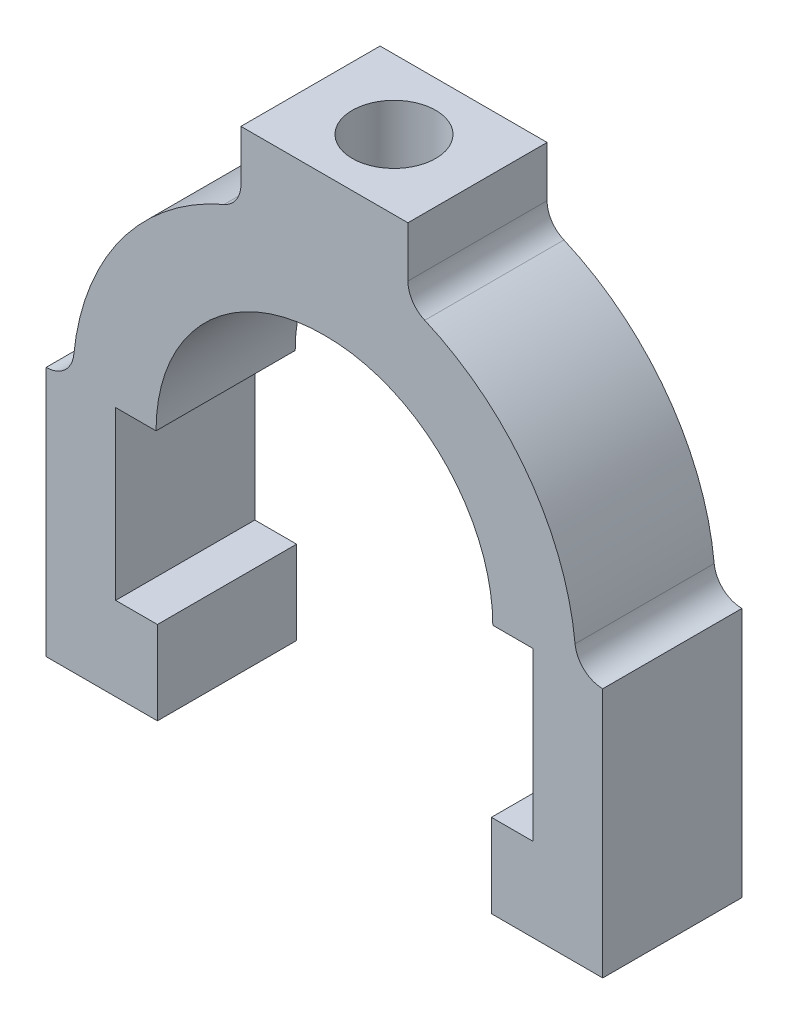
ISO-10303-21;
HEADER;
FILE_DESCRIPTION(('STEP AP214'),'2;1');
FILE_NAME('part.step','',(''),(''),'','','');
FILE_SCHEMA(('AUTOMOTIVE_DESIGN { 1 0 10303 214 1 1 1 1 }'));
ENDSEC;
DATA;
#1=APPLICATION_CONTEXT('core data for automotive mechanical design processes');
#2=APPLICATION_PROTOCOL_DEFINITION('international standard','automotive_design',2000,#1);
#3=PRODUCT_CONTEXT('',#1,'mechanical');
#4=PRODUCT('Part','Part','',(#3));
#5=PRODUCT_RELATED_PRODUCT_CATEGORY('part','',(#4));
#6=PRODUCT_DEFINITION_FORMATION('','',#4);
#7=PRODUCT_DEFINITION_CONTEXT('part definition',#1,'design');
#8=PRODUCT_DEFINITION('design','',#6,#7);
#9=PRODUCT_DEFINITION_SHAPE('','',#8);
#10=(LENGTH_UNIT() NAMED_UNIT(*) SI_UNIT(.MILLI.,.METRE.));
#11=(NAMED_UNIT(*) PLANE_ANGLE_UNIT() SI_UNIT($,.RADIAN.));
#12=(NAMED_UNIT(*) SI_UNIT($,.STERADIAN.) SOLID_ANGLE_UNIT());
#13=UNCERTAINTY_MEASURE_WITH_UNIT(LENGTH_MEASURE(1.E-05),#10,'distance_accuracy_value','');
#14=(GEOMETRIC_REPRESENTATION_CONTEXT(3) GLOBAL_UNCERTAINTY_ASSIGNED_CONTEXT((#13)) GLOBAL_UNIT_ASSIGNED_CONTEXT((#10,
#11,#12)) REPRESENTATION_CONTEXT('',''));
#15=CARTESIAN_POINT('',(0.,0.,0.));
#16=DIRECTION('',(0.,0.,1.));
#17=DIRECTION('',(1.,0.,0.));
#18=AXIS2_PLACEMENT_3D('',#15,#16,#17);
#19=CARTESIAN_POINT('',(39.7994974842648,36.,-20.));
#20=DIRECTION('',(0.,0.,1.));
#21=DIRECTION('',(1.,0.,0.));
#22=AXIS2_PLACEMENT_3D('',#19,#20,#21);
#23=CYLINDRICAL_SURFACE('',#22,36.);
#24=CARTESIAN_POINT('',(39.7994974842648,36.,0.));
#25=DIRECTION('',(0.,0.,1.));
#26=DIRECTION('',(-1.,0.,0.));
#27=AXIS2_PLACEMENT_3D('',#24,#25,#26);
#28=CIRCLE('',#27,36.);
#29=CARTESIAN_POINT('',(25.5799497484265,69.0727147689484,0.));
#30=VERTEX_POINT('',#29);
#31=CARTESIAN_POINT('',(3.97994974842647,39.6,0.));
#32=VERTEX_POINT('',#31);
#33=EDGE_CURVE('E240',#30,#32,#28,.T.);
#34=ORIENTED_EDGE('',*,*,#33,.F.);
#35=DIRECTION('',(0.,0.,1.));
#36=VECTOR('',#35,1.);
#37=CARTESIAN_POINT('',(25.5799497484265,69.0727147689484,-20.));
#38=LINE('',#37,#36);
#39=CARTESIAN_POINT('',(25.5799497484265,69.0727147689484,-20.));
#40=VERTEX_POINT('',#39);
#41=EDGE_CURVE('E50',#40,#30,#38,.T.);
#42=ORIENTED_EDGE('',*,*,#41,.F.);
#43=CARTESIAN_POINT('',(39.7994974842648,36.,-20.));
#44=DIRECTION('',(0.,0.,1.));
#45=DIRECTION('',(-1.,0.,0.));
#46=AXIS2_PLACEMENT_3D('',#43,#44,#45);
#47=CIRCLE('',#46,36.);
#48=CARTESIAN_POINT('',(3.97994974842647,39.6,-20.));
#49=VERTEX_POINT('',#48);
#50=EDGE_CURVE('E306',#40,#49,#47,.T.);
#51=ORIENTED_EDGE('',*,*,#50,.T.);
#52=DIRECTION('',(0.,0.,1.));
#53=VECTOR('',#52,1.);
#54=CARTESIAN_POINT('',(3.97994974842647,39.6,-20.));
#55=LINE('',#54,#53);
#56=EDGE_CURVE('E147',#49,#32,#55,.T.);
#57=ORIENTED_EDGE('',*,*,#56,.T.);
#58=EDGE_LOOP('',(#34,#42,#51,#57));
#59=FACE_BOUND('',#58,.T.);
#60=ADVANCED_FACE('F37',(#59),#23,.T.);
#61=CARTESIAN_POINT('',(24.,72.7474608543871,-20.));
#62=DIRECTION('',(0.,0.,1.));
#63=DIRECTION('',(1.,0.,0.));
#64=AXIS2_PLACEMENT_3D('',#61,#62,#63);
#65=CYLINDRICAL_SURFACE('',#64,4.);
#66=CARTESIAN_POINT('',(24.,72.7474608543871,0.));
#67=DIRECTION('',(0.,0.,-1.));
#68=DIRECTION('',(1.,0.,0.));
#69=AXIS2_PLACEMENT_3D('',#66,#67,#68);
#70=CIRCLE('',#69,4.);
#71=CARTESIAN_POINT('',(28.,72.7474608543871,0.));
#72=VERTEX_POINT('',#71);
#73=EDGE_CURVE('E303',#72,#30,#70,.T.);
#74=ORIENTED_EDGE('',*,*,#73,.F.);
#75=DIRECTION('',(0.,0.,1.));
#76=VECTOR('',#75,1.);
#77=CARTESIAN_POINT('',(28.,72.7474608543871,-20.));
#78=LINE('',#77,#76);
#79=CARTESIAN_POINT('',(28.,72.7474608543871,-20.));
#80=VERTEX_POINT('',#79);
#81=EDGE_CURVE('E221',#80,#72,#78,.T.);
#82=ORIENTED_EDGE('',*,*,#81,.F.);
#83=CARTESIAN_POINT('',(24.,72.7474608543871,-20.));
#84=DIRECTION('',(0.,0.,-1.));
#85=DIRECTION('',(1.,0.,0.));
#86=AXIS2_PLACEMENT_3D('',#83,#84,#85);
#87=CIRCLE('',#86,4.);
#88=EDGE_CURVE('E230',#80,#40,#87,.T.);
#89=ORIENTED_EDGE('',*,*,#88,.T.);
#90=ORIENTED_EDGE('',*,*,#41,.T.);
#91=EDGE_LOOP('',(#74,#82,#89,#90));
#92=FACE_BOUND('',#91,.T.);
#93=ADVANCED_FACE('F351',(#92),#65,.F.);
#94=CARTESIAN_POINT('',(28.,72.7474608543871,-20.));
#95=DIRECTION('',(-1.,0.,0.));
#96=DIRECTION('',(0.,0.,1.));
#97=AXIS2_PLACEMENT_3D('',#94,#95,#96);
#98=PLANE('',#97);
#99=DIRECTION('',(0.,-1.,0.));
#100=VECTOR('',#99,1.);
#101=CARTESIAN_POINT('',(28.,72.7474608543871,0.));
#102=LINE('',#101,#100);
#103=CARTESIAN_POINT('',(28.,80.,0.));
#104=VERTEX_POINT('',#103);
#105=EDGE_CURVE('E216',#104,#72,#102,.T.);
#106=ORIENTED_EDGE('',*,*,#105,.F.);
#107=DIRECTION('',(0.,0.,1.));
#108=VECTOR('',#107,1.);
#109=CARTESIAN_POINT('',(28.,80.,-20.));
#110=LINE('',#109,#108);
#111=CARTESIAN_POINT('',(28.,80.,-20.));
#112=VERTEX_POINT('',#111);
#113=EDGE_CURVE('E210',#112,#104,#110,.T.);
#114=ORIENTED_EDGE('',*,*,#113,.F.);
#115=DIRECTION('',(0.,-1.,0.));
#116=VECTOR('',#115,1.);
#117=CARTESIAN_POINT('',(28.,72.7474608543871,-20.));
#118=LINE('',#117,#116);
#119=EDGE_CURVE('E213',#112,#80,#118,.T.);
#120=ORIENTED_EDGE('',*,*,#119,.T.);
#121=ORIENTED_EDGE('',*,*,#81,.T.);
#122=EDGE_LOOP('',(#106,#114,#120,#121));
#123=FACE_BOUND('',#122,.T.);
#124=ADVANCED_FACE('F212',(#123),#98,.T.);
#125=CARTESIAN_POINT('',(28.,80.,-20.));
#126=DIRECTION('',(0.,1.,0.));
#127=DIRECTION('',(0.,0.,1.));
#128=AXIS2_PLACEMENT_3D('',#125,#126,#127);
#129=PLANE('',#128);
#130=CARTESIAN_POINT('',(40.,80.,-9.99999999999999));
#131=DIRECTION('',(0.,1.,0.));
#132=DIRECTION('',(0.,0.,1.));
#133=AXIS2_PLACEMENT_3D('',#130,#131,#132);
#134=CIRCLE('',#133,5.99999999999999);
#135=CARTESIAN_POINT('',(40.,80.,-4.00000000000001));
#136=VERTEX_POINT('',#135);
#137=EDGE_CURVE('E419',#136,#136,#134,.T.);
#138=ORIENTED_EDGE('',*,*,#137,.F.);
#139=EDGE_LOOP('',(#138));
#140=FACE_BOUND('',#139,.T.);
#141=DIRECTION('',(-1.,0.,0.));
#142=VECTOR('',#141,1.);
#143=CARTESIAN_POINT('',(28.,80.,0.));
#144=LINE('',#143,#142);
#145=CARTESIAN_POINT('',(52.,80.,0.));
#146=VERTEX_POINT('',#145);
#147=EDGE_CURVE('E300',#146,#104,#144,.T.);
#148=ORIENTED_EDGE('',*,*,#147,.F.);
#149=DIRECTION('',(0.,0.,1.));
#150=VECTOR('',#149,1.);
#151=CARTESIAN_POINT('',(52.,80.,-20.));
#152=LINE('',#151,#150);
#153=CARTESIAN_POINT('',(52.,80.,-20.));
#154=VERTEX_POINT('',#153);
#155=EDGE_CURVE('E222',#154,#146,#152,.T.);
#156=ORIENTED_EDGE('',*,*,#155,.F.);
#157=DIRECTION('',(-1.,0.,0.));
#158=VECTOR('',#157,1.);
#159=CARTESIAN_POINT('',(28.,80.,-20.));
#160=LINE('',#159,#158);
#161=EDGE_CURVE('E228',#154,#112,#160,.T.);
#162=ORIENTED_EDGE('',*,*,#161,.T.);
#163=ORIENTED_EDGE('',*,*,#113,.T.);
#164=EDGE_LOOP('',(#148,#156,#162,#163));
#165=FACE_BOUND('',#164,.T.);
#166=ADVANCED_FACE('F232',(#140,#165),#129,.T.);
#167=CARTESIAN_POINT('',(52.,72.7474608543871,-20.));
#168=DIRECTION('',(1.,0.,0.));
#169=DIRECTION('',(0.,0.,-1.));
#170=AXIS2_PLACEMENT_3D('',#167,#168,#169);
#171=PLANE('',#170);
#172=DIRECTION('',(0.,1.,0.));
#173=VECTOR('',#172,1.);
#174=CARTESIAN_POINT('',(52.,72.7474608543871,0.));
#175=LINE('',#174,#173);
#176=CARTESIAN_POINT('',(52.,72.7474608543871,0.));
#177=VERTEX_POINT('',#176);
#178=EDGE_CURVE('E297',#177,#146,#175,.T.);
#179=ORIENTED_EDGE('',*,*,#178,.F.);
#180=DIRECTION('',(0.,0.,1.));
#181=VECTOR('',#180,1.);
#182=CARTESIAN_POINT('',(52.,72.7474608543871,-20.));
#183=LINE('',#182,#181);
#184=CARTESIAN_POINT('',(52.,72.7474608543871,-20.));
#185=VERTEX_POINT('',#184);
#186=EDGE_CURVE('E310',#185,#177,#183,.T.);
#187=ORIENTED_EDGE('',*,*,#186,.F.);
#188=DIRECTION('',(0.,1.,0.));
#189=VECTOR('',#188,1.);
#190=CARTESIAN_POINT('',(52.,72.7474608543871,-20.));
#191=LINE('',#190,#189);
#192=EDGE_CURVE('E233',#185,#154,#191,.T.);
#193=ORIENTED_EDGE('',*,*,#192,.T.);
#194=ORIENTED_EDGE('',*,*,#155,.T.);
#195=EDGE_LOOP('',(#179,#187,#193,#194));
#196=FACE_BOUND('',#195,.T.);
#197=ADVANCED_FACE('F364',(#196),#171,.T.);
#198=CARTESIAN_POINT('',(56.,72.7474608543871,-20.));
#199=DIRECTION('',(0.,0.,1.));
#200=DIRECTION('',(1.,0.,0.));
#201=AXIS2_PLACEMENT_3D('',#198,#199,#200);
#202=CYLINDRICAL_SURFACE('',#201,3.99999999999999);
#203=CARTESIAN_POINT('',(56.,72.7474608543871,0.));
#204=DIRECTION('',(0.,0.,-1.));
#205=DIRECTION('',(-1.,0.,0.));
#206=AXIS2_PLACEMENT_3D('',#203,#204,#205);
#207=CIRCLE('',#206,3.99999999999999);
#208=CARTESIAN_POINT('',(54.4200502515735,69.0727147689484,0.));
#209=VERTEX_POINT('',#208);
#210=EDGE_CURVE('E294',#209,#177,#207,.T.);
#211=ORIENTED_EDGE('',*,*,#210,.F.);
#212=DIRECTION('',(0.,0.,1.));
#213=VECTOR('',#212,1.);
#214=CARTESIAN_POINT('',(54.4200502515735,69.0727147689484,-20.));
#215=LINE('',#214,#213);
#216=CARTESIAN_POINT('',(54.4200502515735,69.0727147689484,-20.));
#217=VERTEX_POINT('',#216);
#218=EDGE_CURVE('E312',#217,#209,#215,.T.);
#219=ORIENTED_EDGE('',*,*,#218,.F.);
#220=CARTESIAN_POINT('',(56.,72.7474608543871,-20.));
#221=DIRECTION('',(0.,0.,-1.));
#222=DIRECTION('',(-1.,0.,0.));
#223=AXIS2_PLACEMENT_3D('',#220,#221,#222);
#224=CIRCLE('',#223,3.99999999999999);
#225=EDGE_CURVE('E235',#217,#185,#224,.T.);
#226=ORIENTED_EDGE('',*,*,#225,.T.);
#227=ORIENTED_EDGE('',*,*,#186,.T.);
#228=EDGE_LOOP('',(#211,#219,#226,#227));
#229=FACE_BOUND('',#228,.T.);
#230=ADVANCED_FACE('F368',(#229),#202,.F.);
#231=CARTESIAN_POINT('',(40.2005025157352,36.,-20.));
#232=DIRECTION('',(0.,0.,1.));
#233=DIRECTION('',(1.,0.,0.));
#234=AXIS2_PLACEMENT_3D('',#231,#232,#233);
#235=CYLINDRICAL_SURFACE('',#234,36.);
#236=CARTESIAN_POINT('',(40.2005025157352,36.,0.));
#237=DIRECTION('',(0.,0.,1.));
#238=DIRECTION('',(1.,0.,0.));
#239=AXIS2_PLACEMENT_3D('',#236,#237,#238);
#240=CIRCLE('',#239,36.);
#241=CARTESIAN_POINT('',(76.0200502515735,39.6,0.));
#242=VERTEX_POINT('',#241);
#243=EDGE_CURVE('E291',#242,#209,#240,.T.);
#244=ORIENTED_EDGE('',*,*,#243,.F.);
#245=DIRECTION('',(0.,0.,1.));
#246=VECTOR('',#245,1.);
#247=CARTESIAN_POINT('',(76.0200502515735,39.6,-20.));
#248=LINE('',#247,#246);
#249=CARTESIAN_POINT('',(76.0200502515735,39.6,-20.));
#250=VERTEX_POINT('',#249);
#251=EDGE_CURVE('E314',#250,#242,#248,.T.);
#252=ORIENTED_EDGE('',*,*,#251,.F.);
#253=CARTESIAN_POINT('',(40.2005025157352,36.,-20.));
#254=DIRECTION('',(0.,0.,1.));
#255=DIRECTION('',(1.,0.,0.));
#256=AXIS2_PLACEMENT_3D('',#253,#254,#255);
#257=CIRCLE('',#256,36.);
#258=EDGE_CURVE('E505',#250,#217,#257,.T.);
#259=ORIENTED_EDGE('',*,*,#258,.T.);
#260=ORIENTED_EDGE('',*,*,#218,.T.);
#261=EDGE_LOOP('',(#244,#252,#259,#260));
#262=FACE_BOUND('',#261,.T.);
#263=ADVANCED_FACE('F372',(#262),#235,.T.);
#264=CARTESIAN_POINT('',(80.,40.,-20.));
#265=DIRECTION('',(0.,0.,1.));
#266=DIRECTION('',(1.,0.,0.));
#267=AXIS2_PLACEMENT_3D('',#264,#265,#266);
#268=CYLINDRICAL_SURFACE('',#267,4.);
#269=CARTESIAN_POINT('',(80.,40.,0.));
#270=DIRECTION('',(0.,0.,-1.));
#271=DIRECTION('',(-1.,0.,0.));
#272=AXIS2_PLACEMENT_3D('',#269,#270,#271);
#273=CIRCLE('',#272,4.);
#274=CARTESIAN_POINT('',(80.,36.,0.));
#275=VERTEX_POINT('',#274);
#276=EDGE_CURVE('E288',#275,#242,#273,.T.);
#277=ORIENTED_EDGE('',*,*,#276,.F.);
#278=DIRECTION('',(0.,0.,1.));
#279=VECTOR('',#278,1.);
#280=CARTESIAN_POINT('',(80.,36.,-20.));
#281=LINE('',#280,#279);
#282=CARTESIAN_POINT('',(80.,36.,-20.));
#283=VERTEX_POINT('',#282);
#284=EDGE_CURVE('E316',#283,#275,#281,.T.);
#285=ORIENTED_EDGE('',*,*,#284,.F.);
#286=CARTESIAN_POINT('',(80.,40.,-20.));
#287=DIRECTION('',(0.,0.,-1.));
#288=DIRECTION('',(-1.,0.,0.));
#289=AXIS2_PLACEMENT_3D('',#286,#287,#288);
#290=CIRCLE('',#289,4.);
#291=EDGE_CURVE('E502',#283,#250,#290,.T.);
#292=ORIENTED_EDGE('',*,*,#291,.T.);
#293=ORIENTED_EDGE('',*,*,#251,.T.);
#294=EDGE_LOOP('',(#277,#285,#292,#293));
#295=FACE_BOUND('',#294,.T.);
#296=ADVANCED_FACE('F376',(#295),#268,.F.);
#297=CARTESIAN_POINT('',(80.,0.,-20.));
#298=DIRECTION('',(1.,0.,0.));
#299=DIRECTION('',(0.,1.,0.));
#300=AXIS2_PLACEMENT_3D('',#297,#298,#299);
#301=PLANE('',#300);
#302=DIRECTION('',(0.,1.,0.));
#303=VECTOR('',#302,1.);
#304=CARTESIAN_POINT('',(80.,0.,0.));
#305=LINE('',#304,#303);
#306=CARTESIAN_POINT('',(80.,0.,0.));
#307=VERTEX_POINT('',#306);
#308=EDGE_CURVE('E285',#307,#275,#305,.T.);
#309=ORIENTED_EDGE('',*,*,#308,.F.);
#310=DIRECTION('',(0.,0.,1.));
#311=VECTOR('',#310,1.);
#312=CARTESIAN_POINT('',(80.,0.,-20.));
#313=LINE('',#312,#311);
#314=CARTESIAN_POINT('',(80.,0.,-20.));
#315=VERTEX_POINT('',#314);
#316=EDGE_CURVE('E318',#315,#307,#313,.T.);
#317=ORIENTED_EDGE('',*,*,#316,.F.);
#318=DIRECTION('',(0.,1.,0.));
#319=VECTOR('',#318,1.);
#320=CARTESIAN_POINT('',(80.,0.,-20.));
#321=LINE('',#320,#319);
#322=EDGE_CURVE('E499',#315,#283,#321,.T.);
#323=ORIENTED_EDGE('',*,*,#322,.T.);
#324=ORIENTED_EDGE('',*,*,#284,.T.);
#325=EDGE_LOOP('',(#309,#317,#323,#324));
#326=FACE_BOUND('',#325,.T.);
#327=ADVANCED_FACE('F380',(#326),#301,.T.);
#328=CARTESIAN_POINT('',(64.,0.,-20.));
#329=DIRECTION('',(0.,-1.,0.));
#330=DIRECTION('',(1.,0.,0.));
#331=AXIS2_PLACEMENT_3D('',#328,#329,#330);
#332=PLANE('',#331);
#333=DIRECTION('',(1.,0.,0.));
#334=VECTOR('',#333,1.);
#335=CARTESIAN_POINT('',(64.,0.,0.));
#336=LINE('',#335,#334);
#337=CARTESIAN_POINT('',(64.,0.,0.));
#338=VERTEX_POINT('',#337);
#339=EDGE_CURVE('E282',#338,#307,#336,.T.);
#340=ORIENTED_EDGE('',*,*,#339,.F.);
#341=DIRECTION('',(0.,0.,1.));
#342=VECTOR('',#341,1.);
#343=CARTESIAN_POINT('',(64.,0.,-20.));
#344=LINE('',#343,#342);
#345=CARTESIAN_POINT('',(64.,0.,-20.));
#346=VERTEX_POINT('',#345);
#347=EDGE_CURVE('E320',#346,#338,#344,.T.);
#348=ORIENTED_EDGE('',*,*,#347,.F.);
#349=DIRECTION('',(1.,0.,0.));
#350=VECTOR('',#349,1.);
#351=CARTESIAN_POINT('',(64.,0.,-20.));
#352=LINE('',#351,#350);
#353=EDGE_CURVE('E496',#346,#315,#352,.T.);
#354=ORIENTED_EDGE('',*,*,#353,.T.);
#355=ORIENTED_EDGE('',*,*,#316,.T.);
#356=EDGE_LOOP('',(#340,#348,#354,#355));
#357=FACE_BOUND('',#356,.T.);
#358=ADVANCED_FACE('F384',(#357),#332,.T.);
#359=CARTESIAN_POINT('',(64.,12.,-20.));
#360=DIRECTION('',(-1.,0.,0.));
#361=DIRECTION('',(0.,0.,1.));
#362=AXIS2_PLACEMENT_3D('',#359,#360,#361);
#363=PLANE('',#362);
#364=DIRECTION('',(0.,-1.,0.));
#365=VECTOR('',#364,1.);
#366=CARTESIAN_POINT('',(64.,12.,0.));
#367=LINE('',#366,#365);
#368=CARTESIAN_POINT('',(64.,12.,0.));
#369=VERTEX_POINT('',#368);
#370=EDGE_CURVE('E279',#369,#338,#367,.T.);
#371=ORIENTED_EDGE('',*,*,#370,.F.);
#372=DIRECTION('',(0.,0.,1.));
#373=VECTOR('',#372,1.);
#374=CARTESIAN_POINT('',(64.,12.,-20.));
#375=LINE('',#374,#373);
#376=CARTESIAN_POINT('',(64.,12.,-20.));
#377=VERTEX_POINT('',#376);
#378=EDGE_CURVE('E322',#377,#369,#375,.T.);
#379=ORIENTED_EDGE('',*,*,#378,.F.);
#380=DIRECTION('',(0.,-1.,0.));
#381=VECTOR('',#380,1.);
#382=CARTESIAN_POINT('',(64.,12.,-20.));
#383=LINE('',#382,#381);
#384=EDGE_CURVE('E493',#377,#346,#383,.T.);
#385=ORIENTED_EDGE('',*,*,#384,.T.);
#386=ORIENTED_EDGE('',*,*,#347,.T.);
#387=EDGE_LOOP('',(#371,#379,#385,#386));
#388=FACE_BOUND('',#387,.T.);
#389=ADVANCED_FACE('F388',(#388),#363,.T.);
#390=CARTESIAN_POINT('',(64.,12.,-20.));
#391=DIRECTION('',(0.,1.,0.));
#392=DIRECTION('',(-1.,0.,0.));
#393=AXIS2_PLACEMENT_3D('',#390,#391,#392);
#394=PLANE('',#393);
#395=DIRECTION('',(-1.,0.,0.));
#396=VECTOR('',#395,1.);
#397=CARTESIAN_POINT('',(64.,12.,0.));
#398=LINE('',#397,#396);
#399=CARTESIAN_POINT('',(70.,12.,0.));
#400=VERTEX_POINT('',#399);
#401=EDGE_CURVE('E276',#400,#369,#398,.T.);
#402=ORIENTED_EDGE('',*,*,#401,.F.);
#403=DIRECTION('',(0.,0.,1.));
#404=VECTOR('',#403,1.);
#405=CARTESIAN_POINT('',(70.,12.,-20.));
#406=LINE('',#405,#404);
#407=CARTESIAN_POINT('',(70.,12.,-20.));
#408=VERTEX_POINT('',#407);
#409=EDGE_CURVE('E324',#408,#400,#406,.T.);
#410=ORIENTED_EDGE('',*,*,#409,.F.);
#411=DIRECTION('',(-1.,0.,0.));
#412=VECTOR('',#411,1.);
#413=CARTESIAN_POINT('',(64.,12.,-20.));
#414=LINE('',#413,#412);
#415=EDGE_CURVE('E490',#408,#377,#414,.T.);
#416=ORIENTED_EDGE('',*,*,#415,.T.);
#417=ORIENTED_EDGE('',*,*,#378,.T.);
#418=EDGE_LOOP('',(#402,#410,#416,#417));
#419=FACE_BOUND('',#418,.T.);
#420=ADVANCED_FACE('F392',(#419),#394,.T.);
#421=CARTESIAN_POINT('',(70.,12.,-20.));
#422=DIRECTION('',(-1.,0.,0.));
#423=DIRECTION('',(0.,0.,1.));
#424=AXIS2_PLACEMENT_3D('',#421,#422,#423);
#425=PLANE('',#424);
#426=DIRECTION('',(0.,-1.,0.));
#427=VECTOR('',#426,1.);
#428=CARTESIAN_POINT('',(70.,12.,0.));
#429=LINE('',#428,#427);
#430=CARTESIAN_POINT('',(70.,36.,0.));
#431=VERTEX_POINT('',#430);
#432=EDGE_CURVE('E273',#431,#400,#429,.T.);
#433=ORIENTED_EDGE('',*,*,#432,.F.);
#434=DIRECTION('',(0.,0.,1.));
#435=VECTOR('',#434,1.);
#436=CARTESIAN_POINT('',(70.,36.,-20.));
#437=LINE('',#436,#435);
#438=CARTESIAN_POINT('',(70.,36.,-20.));
#439=VERTEX_POINT('',#438);
#440=EDGE_CURVE('E326',#439,#431,#437,.T.);
#441=ORIENTED_EDGE('',*,*,#440,.F.);
#442=DIRECTION('',(0.,-1.,0.));
#443=VECTOR('',#442,1.);
#444=CARTESIAN_POINT('',(70.,12.,-20.));
#445=LINE('',#444,#443);
#446=EDGE_CURVE('E487',#439,#408,#445,.T.);
#447=ORIENTED_EDGE('',*,*,#446,.T.);
#448=ORIENTED_EDGE('',*,*,#409,.T.);
#449=EDGE_LOOP('',(#433,#441,#447,#448));
#450=FACE_BOUND('',#449,.T.);
#451=ADVANCED_FACE('F396',(#450),#425,.T.);
#452=CARTESIAN_POINT('',(70.,36.,-20.));
#453=DIRECTION('',(0.,-1.,0.));
#454=DIRECTION('',(0.,0.,-1.));
#455=AXIS2_PLACEMENT_3D('',#452,#453,#454);
#456=PLANE('',#455);
#457=DIRECTION('',(1.,0.,0.));
#458=VECTOR('',#457,1.);
#459=CARTESIAN_POINT('',(70.,36.,0.));
#460=LINE('',#459,#458);
#461=CARTESIAN_POINT('',(64.2005025157352,36.,0.));
#462=VERTEX_POINT('',#461);
#463=EDGE_CURVE('E270',#462,#431,#460,.T.);
#464=ORIENTED_EDGE('',*,*,#463,.F.);
#465=DIRECTION('',(0.,0.,1.));
#466=VECTOR('',#465,1.);
#467=CARTESIAN_POINT('',(64.2005025157352,36.,-20.));
#468=LINE('',#467,#466);
#469=CARTESIAN_POINT('',(64.2005025157352,36.,-20.));
#470=VERTEX_POINT('',#469);
#471=EDGE_CURVE('E328',#470,#462,#468,.T.);
#472=ORIENTED_EDGE('',*,*,#471,.F.);
#473=DIRECTION('',(1.,0.,0.));
#474=VECTOR('',#473,1.);
#475=CARTESIAN_POINT('',(70.,36.,-20.));
#476=LINE('',#475,#474);
#477=EDGE_CURVE('E484',#470,#439,#476,.T.);
#478=ORIENTED_EDGE('',*,*,#477,.T.);
#479=ORIENTED_EDGE('',*,*,#440,.T.);
#480=EDGE_LOOP('',(#464,#472,#478,#479));
#481=FACE_BOUND('',#480,.T.);
#482=ADVANCED_FACE('F400',(#481),#456,.T.);
#483=CARTESIAN_POINT('',(40.2005025157352,36.,-20.));
#484=DIRECTION('',(0.,0.,1.));
#485=DIRECTION('',(1.,0.,0.));
#486=AXIS2_PLACEMENT_3D('',#483,#484,#485);
#487=CYLINDRICAL_SURFACE('',#486,24.);
#488=CARTESIAN_POINT('',(40.,59.9991624591606,-16.));
#489=CARTESIAN_POINT('',(40.1657998626506,60.0005645740396,-16.0000208796225));
#490=CARTESIAN_POINT('',(40.3316088062019,60.0002152206767,-15.9931285121241));
#491=CARTESIAN_POINT('',(40.6620240147754,59.9961262270648,-15.96566297521));
#492=CARTESIAN_POINT('',(40.8266304529161,59.9923870849244,-15.9450918159269));
#493=CARTESIAN_POINT('',(41.1531640506243,59.9816415521394,-15.8904653635917));
#494=CARTESIAN_POINT('',(41.3150956396165,59.9746412760365,-15.8564353235491));
#495=CARTESIAN_POINT('',(41.6354469132188,59.9576010919945,-15.7751724175957));
#496=CARTESIAN_POINT('',(41.7938665695379,59.9475611595783,-15.7279394453678));
#497=CARTESIAN_POINT('',(42.1060604744631,59.9247434094346,-15.620653817757));
#498=CARTESIAN_POINT('',(42.2598356941701,59.9119661686339,-15.560603863746));
#499=CARTESIAN_POINT('',(42.5617938475007,59.8840386742915,-15.4281125566064));
#500=CARTESIAN_POINT('',(42.7099746835408,59.8688875414252,-15.3556666108999));
#501=CARTESIAN_POINT('',(42.9996832893265,59.8366488662837,-15.1989440324902));
#502=CARTESIAN_POINT('',(43.1412122750603,59.8195616798911,-15.1146695734091));
#503=CARTESIAN_POINT('',(43.4167895415876,59.7839191864636,-14.9348384830768));
#504=CARTESIAN_POINT('',(43.5508349823498,59.7653633284352,-14.8392776108826));
#505=CARTESIAN_POINT('',(43.8127721642369,59.7269747583267,-14.6358106599808));
#506=CARTESIAN_POINT('',(43.9405187990457,59.7071255972878,-14.5277208456814));
#507=CARTESIAN_POINT('',(44.1865524134567,59.6670013220814,-14.3012492817593));
#508=CARTESIAN_POINT('',(44.3048358693949,59.6467260527659,-14.1828637323952));
#509=CARTESIAN_POINT('',(44.5310977375962,59.6063371276395,-13.9366360855963));
#510=CARTESIAN_POINT('',(44.6390779447802,59.5862234442399,-13.8087956422049));
#511=CARTESIAN_POINT('',(44.8440735322448,59.5467227393701,-13.5444239293652));
#512=CARTESIAN_POINT('',(44.9410848455675,59.5273359891954,-13.4078894655568));
#513=CARTESIAN_POINT('',(45.1248073500193,59.4895754172677,-13.1249369266961));
#514=CARTESIAN_POINT('',(45.2113406945269,59.4712213346954,-12.9784006553745));
#515=CARTESIAN_POINT('',(45.3717608793441,59.4363996879884,-12.6782733745571));
#516=CARTESIAN_POINT('',(45.4456429410083,59.4199328374727,-12.5246797270092));
#517=CARTESIAN_POINT('',(45.5801109934898,59.3894114299389,-12.2116427055373));
#518=CARTESIAN_POINT('',(45.6407040993898,59.3753555829204,-12.0522025155689));
#519=CARTESIAN_POINT('',(45.7481704596417,59.3500842036991,-11.7284768256768));
#520=CARTESIAN_POINT('',(45.7950388043564,59.3388696880934,-11.5641896149478));
#521=CARTESIAN_POINT('',(45.8739023429829,59.3198231375297,-11.2350642414021));
#522=CARTESIAN_POINT('',(45.9061528317277,59.3119332271708,-11.0702905879948));
#523=CARTESIAN_POINT('',(45.9567429891781,59.2994930494543,-10.7384942920673));
#524=CARTESIAN_POINT('',(45.9750826684965,59.2949427795488,-10.5714716512631));
#525=CARTESIAN_POINT('',(45.9976898787213,59.2893270608314,-10.2364377080787));
#526=CARTESIAN_POINT('',(46.001959053237,59.2882612049968,-10.0684265234699));
#527=CARTESIAN_POINT('',(45.9963921208635,59.2896473187993,-9.73265363593856));
#528=CARTESIAN_POINT('',(45.986556184161,59.2920992459921,-9.56489193003044));
#529=CARTESIAN_POINT('',(45.9532526776318,59.3003465630632,-9.23470020097342));
#530=CARTESIAN_POINT('',(45.9301025984744,59.3060640605526,-9.0722360863209));
#531=CARTESIAN_POINT('',(45.8706113004525,59.3206089683614,-8.74988616787074));
#532=CARTESIAN_POINT('',(45.8342702778154,59.3294363324185,-8.59000032575586));
#533=CARTESIAN_POINT('',(45.7486793850977,59.3499393516919,-8.27387513781966));
#534=CARTESIAN_POINT('',(45.6994267805599,59.3616156102201,-8.11763657207289));
#535=CARTESIAN_POINT('',(45.5884159775111,59.3874674216421,-7.8099432787447));
#536=CARTESIAN_POINT('',(45.5266619713582,59.4016421364704,-7.65848696706044));
#537=CARTESIAN_POINT('',(45.3904296745275,59.4322336664708,-7.35983534771046));
#538=CARTESIAN_POINT('',(45.3158326378665,59.4486710892784,-7.21269633046868));
#539=CARTESIAN_POINT('',(45.154906090896,59.4831993536372,-6.92525364616526));
#540=CARTESIAN_POINT('',(45.0685805669741,59.5012896327189,-6.7849476785399));
#541=CARTESIAN_POINT('',(44.8847279923094,59.5386242425383,-6.51194492789421));
#542=CARTESIAN_POINT('',(44.7871957284914,59.5578691083535,-6.37925172951125));
#543=CARTESIAN_POINT('',(44.5816440764233,59.5969603312772,-6.12242574392962));
#544=CARTESIAN_POINT('',(44.4736282590737,59.6168064820031,-5.99829006634329));
#545=CARTESIAN_POINT('',(44.2447359373322,59.6570927203927,-5.75609623904736));
#546=CARTESIAN_POINT('',(44.1235917778408,59.6775344332211,-5.63829115457885));
#547=CARTESIAN_POINT('',(43.8717977868318,59.7178801505504,-5.41331537439148));
#548=CARTESIAN_POINT('',(43.741151351776,59.737784343726,-5.30614091096206));
#549=CARTESIAN_POINT('',(43.4710934839977,59.7764978494705,-5.10305492884204));
#550=CARTESIAN_POINT('',(43.3316765662381,59.7953064624188,-5.00715056814752));
#551=CARTESIAN_POINT('',(43.0451407460301,59.8312582634936,-4.82740792787975));
#552=CARTESIAN_POINT('',(42.898024867034,59.8484020979522,-4.74356495946625));
#553=CARTESIAN_POINT('',(42.5966010810345,59.8805726043422,-4.58830090504363));
#554=CARTESIAN_POINT('',(42.4422733426493,59.8955929182007,-4.51691697923713));
#555=CARTESIAN_POINT('',(42.127974790341,59.9229956428187,-4.38746082060756));
#556=CARTESIAN_POINT('',(41.9680062539945,59.9353791043569,-4.32938328451896));
#557=CARTESIAN_POINT('',(41.64368930552,59.9571199572321,-4.22703094821343));
#558=CARTESIAN_POINT('',(41.4793454393262,59.9664803661445,-4.18274238560446));
#559=CARTESIAN_POINT('',(41.1474063966824,59.9818882314464,-4.10827923019933));
#560=CARTESIAN_POINT('',(40.9798127603095,59.9879372192314,-4.07809811423748));
#561=CARTESIAN_POINT('',(40.6767530162543,59.9956510004302,-4.03674404156108));
#562=CARTESIAN_POINT('',(40.541653226765,59.997955533706,-4.02295959326028));
#563=CARTESIAN_POINT('',(40.271035952016,60.000278974738,-4.00459135599405));
#564=CARTESIAN_POINT('',(40.1355195336862,60.0003016736315,-3.9999923184582));
#565=CARTESIAN_POINT('',(40.,59.9991624591606,-4.00000000000002));
#566=B_SPLINE_CURVE_WITH_KNOTS('',3,(#488,#489,#490,#491,#492,#493,#494,#495,#496,#497,#498,
#499,#500,#501,#502,#503,#504,#505,#506,#507,#508,#509,#510,#511,#512,#513,#514,#515,#516,#517,
#518,#519,#520,#521,#522,#523,#524,#525,#526,#527,#528,#529,#530,#531,#532,#533,#534,#535,#536,
#537,#538,#539,#540,#541,#542,#543,#544,#545,#546,#547,#548,#549,#550,#551,#552,#553,#554,#555,
#556,#557,#558,#559,#560,#561,#562,#563,#564,#565),.UNSPECIFIED.,.F.,.F.,(4,2,2,2,2,2,2,2,2,2,2,
2,2,2,2,2,2,2,2,2,2,2,2,2,2,2,2,2,2,2,2,2,2,2,2,2,2,2,4),(0.,0.497256640413874,
0.994440223866206,1.4906953299326,1.98695443222639,2.48310904354149,2.97944787424939,
3.47569561625103,3.97213042339122,4.47708576247162,4.98222825756814,5.48728259089631,
5.99252357434492,6.50540115143377,7.01847202746256,7.53126752426406,8.04424623540358,
8.54788374088771,9.05152086213169,9.55509915022949,10.0586713623995,10.5507057559212,
11.0427328302736,11.5348641920337,12.0268307896048,12.5236177561258,13.020236290521,
13.5170867809933,14.0137686246104,14.5238016265348,15.0336532114863,15.5438268887602,
16.0538016980406,16.5652724831371,17.0765390654227,17.5872937186739,18.0978119690357,
18.5049537555181,18.9114190880173),.UNSPECIFIED.);
#567=CARTESIAN_POINT('',(40.,59.9991624591606,-16.));
#568=VERTEX_POINT('',#567);
#569=CARTESIAN_POINT('',(40.,59.9991624591606,-4.00000000000002));
#570=VERTEX_POINT('',#569);
#571=EDGE_CURVE('E55',#568,#570,#566,.T.);
#572=ORIENTED_EDGE('',*,*,#571,.F.);
#573=DIRECTION('',(0.,0.,1.));
#574=VECTOR('',#573,1.);
#575=CARTESIAN_POINT('',(40.,59.9991624591606,-20.));
#576=LINE('',#575,#574);
#577=CARTESIAN_POINT('',(40.,59.9991624591606,-20.));
#578=VERTEX_POINT('',#577);
#579=EDGE_CURVE('E330',#578,#568,#576,.T.);
#580=ORIENTED_EDGE('',*,*,#579,.F.);
#581=CARTESIAN_POINT('',(40.2005025157352,36.,-20.));
#582=DIRECTION('',(0.,0.,-1.));
#583=DIRECTION('',(1.,0.,0.));
#584=AXIS2_PLACEMENT_3D('',#581,#582,#583);
#585=CIRCLE('',#584,24.);
#586=EDGE_CURVE('E481',#578,#470,#585,.T.);
#587=ORIENTED_EDGE('',*,*,#586,.T.);
#588=ORIENTED_EDGE('',*,*,#471,.T.);
#589=CARTESIAN_POINT('',(40.2005025157352,36.,0.));
#590=DIRECTION('',(0.,0.,-1.));
#591=DIRECTION('',(1.,0.,0.));
#592=AXIS2_PLACEMENT_3D('',#589,#590,#591);
#593=CIRCLE('',#592,24.);
#594=CARTESIAN_POINT('',(40.,59.9991624591606,0.));
#595=VERTEX_POINT('',#594);
#596=EDGE_CURVE('E267',#595,#462,#593,.T.);
#597=ORIENTED_EDGE('',*,*,#596,.F.);
#598=EDGE_CURVE('E333',#570,#595,#576,.T.);
#599=ORIENTED_EDGE('',*,*,#598,.F.);
#600=EDGE_LOOP('',(#572,#580,#587,#588,#597,#599));
#601=FACE_BOUND('',#600,.T.);
#602=ADVANCED_FACE('F404',(#601),#487,.F.);
#603=CARTESIAN_POINT('',(39.7994974842648,36.,-20.));
#604=DIRECTION('',(0.,0.,1.));
#605=DIRECTION('',(1.,0.,0.));
#606=AXIS2_PLACEMENT_3D('',#603,#604,#605);
#607=CYLINDRICAL_SURFACE('',#606,24.);
#608=CARTESIAN_POINT('',(40.,59.9991624591606,-4.00000000000002));
#609=CARTESIAN_POINT('',(39.8342001373494,60.0005645740396,-3.99997912037749));
#610=CARTESIAN_POINT('',(39.6683911937981,60.0002152206767,-4.00687148787586));
#611=CARTESIAN_POINT('',(39.3379759852246,59.9961262270648,-4.03433702478999));
#612=CARTESIAN_POINT('',(39.1733695470839,59.9923870849244,-4.05490818407311));
#613=CARTESIAN_POINT('',(38.8468359493757,59.9816415521394,-4.10953463640831));
#614=CARTESIAN_POINT('',(38.6849043603835,59.9746412760365,-4.14356467645088));
#615=CARTESIAN_POINT('',(38.3645530867812,59.9576010919945,-4.2248275824043));
#616=CARTESIAN_POINT('',(38.2061334304621,59.9475611595783,-4.27206055463223));
#617=CARTESIAN_POINT('',(37.8939395255369,59.9247434094346,-4.37934618224305));
#618=CARTESIAN_POINT('',(37.7401643058299,59.9119661686339,-4.43939613625396));
#619=CARTESIAN_POINT('',(37.4382061524993,59.8840386742915,-4.57188744339363));
#620=CARTESIAN_POINT('',(37.2900253164592,59.8688875414252,-4.64433338910013));
#621=CARTESIAN_POINT('',(37.0003167106735,59.8366488662837,-4.80105596750977));
#622=CARTESIAN_POINT('',(36.8587877249397,59.8195616798911,-4.88533042659086));
#623=CARTESIAN_POINT('',(36.5832104584124,59.7839191864636,-5.06516151692316));
#624=CARTESIAN_POINT('',(36.4491650176502,59.7653633284352,-5.16072238911742));
#625=CARTESIAN_POINT('',(36.1872278357632,59.7269747583267,-5.36418934001924));
#626=CARTESIAN_POINT('',(36.0594812009543,59.7071255972878,-5.47227915431859));
#627=CARTESIAN_POINT('',(35.8134475865433,59.6670013220814,-5.69875071824068));
#628=CARTESIAN_POINT('',(35.6951641306051,59.6467260527659,-5.81713626760483));
#629=CARTESIAN_POINT('',(35.4689022624038,59.6063371276395,-6.06336391440371));
#630=CARTESIAN_POINT('',(35.3609220552198,59.5862234442399,-6.19120435779513));
#631=CARTESIAN_POINT('',(35.1559264677552,59.5467227393701,-6.45557607063484));
#632=CARTESIAN_POINT('',(35.0589151544325,59.5273359891954,-6.59211053444319));
#633=CARTESIAN_POINT('',(34.8751926499807,59.4895754172677,-6.87506307330389));
#634=CARTESIAN_POINT('',(34.7886593054731,59.4712213346954,-7.02159934462553));
#635=CARTESIAN_POINT('',(34.628239120656,59.4363996879884,-7.32172662544286));
#636=CARTESIAN_POINT('',(34.5543570589918,59.4199328374727,-7.47532027299082));
#637=CARTESIAN_POINT('',(34.4198890065102,59.3894114299389,-7.78835729446269));
#638=CARTESIAN_POINT('',(34.3592959006102,59.3753555829204,-7.94779748443114));
#639=CARTESIAN_POINT('',(34.2518295403583,59.3500842036991,-8.27152317432319));
#640=CARTESIAN_POINT('',(34.2049611956437,59.3388696880934,-8.43581038505224));
#641=CARTESIAN_POINT('',(34.1260976570171,59.3198231375297,-8.76493575859787));
#642=CARTESIAN_POINT('',(34.0938471682723,59.3119332271708,-8.92970941200521));
#643=CARTESIAN_POINT('',(34.0432570108219,59.2994930494543,-9.26150570793271));
#644=CARTESIAN_POINT('',(34.0249173315035,59.2949427795488,-9.42852834873695));
#645=CARTESIAN_POINT('',(34.0023101212787,59.2893270608314,-9.76356229192128));
#646=CARTESIAN_POINT('',(33.998040946763,59.2882612049968,-9.93157347653014));
#647=CARTESIAN_POINT('',(34.0036078791365,59.2896473187993,-10.2673463640614));
#648=CARTESIAN_POINT('',(34.013443815839,59.2920992459921,-10.4351080699696));
#649=CARTESIAN_POINT('',(34.0467473223682,59.3003465630632,-10.7652997990266));
#650=CARTESIAN_POINT('',(34.0698974015256,59.3060640605526,-10.9277639136791));
#651=CARTESIAN_POINT('',(34.1293886995476,59.3206089683614,-11.2501138321293));
#652=CARTESIAN_POINT('',(34.1657297221846,59.3294363324185,-11.4099996742442));
#653=CARTESIAN_POINT('',(34.2513206149023,59.3499393516919,-11.7261248621803));
#654=CARTESIAN_POINT('',(34.3005732194401,59.3616156102202,-11.8823634279271));
#655=CARTESIAN_POINT('',(34.4115840224889,59.3874674216421,-12.1900567212553));
#656=CARTESIAN_POINT('',(34.4733380286418,59.4016421364704,-12.3415130329396));
#657=CARTESIAN_POINT('',(34.6095703254725,59.4322336664708,-12.6401646522895));
#658=CARTESIAN_POINT('',(34.6841673621335,59.4486710892784,-12.7873036695313));
#659=CARTESIAN_POINT('',(34.845093909104,59.4831993536372,-13.0747463538347));
#660=CARTESIAN_POINT('',(34.9314194330259,59.5012896327189,-13.2150523214601));
#661=CARTESIAN_POINT('',(35.1152720076907,59.5386242425383,-13.4880550721058));
#662=CARTESIAN_POINT('',(35.2128042715086,59.5578691083535,-13.6207482704887));
#663=CARTESIAN_POINT('',(35.4183559235767,59.5969603312772,-13.8775742560704));
#664=CARTESIAN_POINT('',(35.5263717409263,59.6168064820031,-14.0017099336567));
#665=CARTESIAN_POINT('',(35.7552640626679,59.6570927203927,-14.2439037609526));
#666=CARTESIAN_POINT('',(35.8764082221593,59.6775344332211,-14.3617088454212));
#667=CARTESIAN_POINT('',(36.1282022131683,59.7178801505504,-14.5866846256085));
#668=CARTESIAN_POINT('',(36.258848648224,59.737784343726,-14.6938590890379));
#669=CARTESIAN_POINT('',(36.5289065160024,59.7764978494705,-14.896945071158));
#670=CARTESIAN_POINT('',(36.6683234337619,59.7953064624188,-14.9928494318525));
#671=CARTESIAN_POINT('',(36.9548592539699,59.8312582634936,-15.1725920721203));
#672=CARTESIAN_POINT('',(37.1019751329661,59.8484020979522,-15.2564350405338));
#673=CARTESIAN_POINT('',(37.4033989189655,59.8805726043422,-15.4116990949564));
#674=CARTESIAN_POINT('',(37.5577266573507,59.8955929182007,-15.4830830207629));
#675=CARTESIAN_POINT('',(37.872025209659,59.9229956428187,-15.6125391793924));
#676=CARTESIAN_POINT('',(38.0319937460055,59.9353791043569,-15.670616715481));
#677=CARTESIAN_POINT('',(38.3563106944801,59.9571199572321,-15.7729690517866));
#678=CARTESIAN_POINT('',(38.5206545606739,59.9664803661445,-15.8172576143955));
#679=CARTESIAN_POINT('',(38.8525936033176,59.9818882314464,-15.8917207698007));
#680=CARTESIAN_POINT('',(39.0201872396906,59.9879372192314,-15.9219018857625));
#681=CARTESIAN_POINT('',(39.3232469837457,59.9956510004302,-15.9632559584389));
#682=CARTESIAN_POINT('',(39.458346773235,59.997955533706,-15.9770404067397));
#683=CARTESIAN_POINT('',(39.728964047984,60.000278974738,-15.9954086440059));
#684=CARTESIAN_POINT('',(39.8644804663138,60.0003016736315,-16.0000076815418));
#685=CARTESIAN_POINT('',(40.,59.9991624591606,-16.));
#686=B_SPLINE_CURVE_WITH_KNOTS('',3,(#608,#609,#610,#611,#612,#613,#614,#615,#616,#617,#618,
#619,#620,#621,#622,#623,#624,#625,#626,#627,#628,#629,#630,#631,#632,#633,#634,#635,#636,#637,
#638,#639,#640,#641,#642,#643,#644,#645,#646,#647,#648,#649,#650,#651,#652,#653,#654,#655,#656,
#657,#658,#659,#660,#661,#662,#663,#664,#665,#666,#667,#668,#669,#670,#671,#672,#673,#674,#675,
#676,#677,#678,#679,#680,#681,#682,#683,#684,#685),.UNSPECIFIED.,.F.,.F.,(4,2,2,2,2,2,2,2,2,2,2,
2,2,2,2,2,2,2,2,2,2,2,2,2,2,2,2,2,2,2,2,2,2,2,2,2,2,2,4),(0.,0.49725664041388,0.994440223866206,
1.4906953299326,1.98695443222639,2.48310904354151,2.97944787424939,3.47569561625103,
3.97213042339122,4.47708576247163,4.98222825756815,5.4872825908963,5.99252357434492,
6.50540115143377,7.01847202746256,7.53126752426406,8.04424623540357,8.54788374088771,
9.0515208621317,9.55509915022949,10.0586713623995,10.5507057559212,11.0427328302736,
11.5348641920337,12.0268307896048,12.5236177561258,13.020236290521,13.5170867809933,
14.0137686246104,14.5238016265348,15.0336532114863,15.5438268887602,16.0538016980406,
16.5652724831371,17.0765390654227,17.5872937186739,18.0978119690357,18.5049537555181,
18.9114190880172),.UNSPECIFIED.);
#687=EDGE_CURVE('E11',#570,#568,#686,.T.);
#688=ORIENTED_EDGE('',*,*,#687,.F.);
#689=ORIENTED_EDGE('',*,*,#598,.T.);
#690=CARTESIAN_POINT('',(39.7994974842648,36.,0.));
#691=DIRECTION('',(0.,0.,-1.));
#692=DIRECTION('',(-1.,0.,0.));
#693=AXIS2_PLACEMENT_3D('',#690,#691,#692);
#694=CIRCLE('',#693,24.);
#695=CARTESIAN_POINT('',(15.7994974842648,36.,0.));
#696=VERTEX_POINT('',#695);
#697=EDGE_CURVE('E264',#696,#595,#694,.T.);
#698=ORIENTED_EDGE('',*,*,#697,.F.);
#699=DIRECTION('',(0.,0.,1.));
#700=VECTOR('',#699,1.);
#701=CARTESIAN_POINT('',(15.7994974842648,36.,-20.));
#702=LINE('',#701,#700);
#703=CARTESIAN_POINT('',(15.7994974842648,36.,-20.));
#704=VERTEX_POINT('',#703);
#705=EDGE_CURVE('E334',#704,#696,#702,.T.);
#706=ORIENTED_EDGE('',*,*,#705,.F.);
#707=CARTESIAN_POINT('',(39.7994974842648,36.,-20.));
#708=DIRECTION('',(0.,0.,-1.));
#709=DIRECTION('',(-1.,0.,0.));
#710=AXIS2_PLACEMENT_3D('',#707,#708,#709);
#711=CIRCLE('',#710,24.);
#712=EDGE_CURVE('E473',#704,#578,#711,.T.);
#713=ORIENTED_EDGE('',*,*,#712,.T.);
#714=ORIENTED_EDGE('',*,*,#579,.T.);
#715=EDGE_LOOP('',(#688,#689,#698,#706,#713,#714));
#716=FACE_BOUND('',#715,.T.);
#717=ADVANCED_FACE('F408',(#716),#607,.F.);
#718=CARTESIAN_POINT('',(10.,36.,-20.));
#719=DIRECTION('',(0.,-1.,0.));
#720=DIRECTION('',(0.,0.,-1.));
#721=AXIS2_PLACEMENT_3D('',#718,#719,#720);
#722=PLANE('',#721);
#723=DIRECTION('',(1.,0.,0.));
#724=VECTOR('',#723,1.);
#725=CARTESIAN_POINT('',(10.,36.,0.));
#726=LINE('',#725,#724);
#727=CARTESIAN_POINT('',(10.,36.,0.));
#728=VERTEX_POINT('',#727);
#729=EDGE_CURVE('E261',#728,#696,#726,.T.);
#730=ORIENTED_EDGE('',*,*,#729,.F.);
#731=DIRECTION('',(0.,0.,1.));
#732=VECTOR('',#731,1.);
#733=CARTESIAN_POINT('',(10.,36.,-20.));
#734=LINE('',#733,#732);
#735=CARTESIAN_POINT('',(10.,36.,-20.));
#736=VERTEX_POINT('',#735);
#737=EDGE_CURVE('E336',#736,#728,#734,.T.);
#738=ORIENTED_EDGE('',*,*,#737,.F.);
#739=DIRECTION('',(1.,0.,0.));
#740=VECTOR('',#739,1.);
#741=CARTESIAN_POINT('',(10.,36.,-20.));
#742=LINE('',#741,#740);
#743=EDGE_CURVE('E470',#736,#704,#742,.T.);
#744=ORIENTED_EDGE('',*,*,#743,.T.);
#745=ORIENTED_EDGE('',*,*,#705,.T.);
#746=EDGE_LOOP('',(#730,#738,#744,#745));
#747=FACE_BOUND('',#746,.T.);
#748=ADVANCED_FACE('F451',(#747),#722,.T.);
#749=CARTESIAN_POINT('',(10.,12.,-20.));
#750=DIRECTION('',(1.,0.,0.));
#751=DIRECTION('',(0.,1.,0.));
#752=AXIS2_PLACEMENT_3D('',#749,#750,#751);
#753=PLANE('',#752);
#754=DIRECTION('',(0.,1.,0.));
#755=VECTOR('',#754,1.);
#756=CARTESIAN_POINT('',(10.,12.,0.));
#757=LINE('',#756,#755);
#758=CARTESIAN_POINT('',(10.,12.,0.));
#759=VERTEX_POINT('',#758);
#760=EDGE_CURVE('E258',#759,#728,#757,.T.);
#761=ORIENTED_EDGE('',*,*,#760,.F.);
#762=DIRECTION('',(0.,0.,1.));
#763=VECTOR('',#762,1.);
#764=CARTESIAN_POINT('',(10.,12.,-20.));
#765=LINE('',#764,#763);
#766=CARTESIAN_POINT('',(10.,12.,-20.));
#767=VERTEX_POINT('',#766);
#768=EDGE_CURVE('E338',#767,#759,#765,.T.);
#769=ORIENTED_EDGE('',*,*,#768,.F.);
#770=DIRECTION('',(0.,1.,0.));
#771=VECTOR('',#770,1.);
#772=CARTESIAN_POINT('',(10.,12.,-20.));
#773=LINE('',#772,#771);
#774=EDGE_CURVE('E467',#767,#736,#773,.T.);
#775=ORIENTED_EDGE('',*,*,#774,.T.);
#776=ORIENTED_EDGE('',*,*,#737,.T.);
#777=EDGE_LOOP('',(#761,#769,#775,#776));
#778=FACE_BOUND('',#777,.T.);
#779=ADVANCED_FACE('F448',(#778),#753,.T.);
#780=CARTESIAN_POINT('',(16.,12.,-20.));
#781=DIRECTION('',(0.,1.,0.));
#782=DIRECTION('',(-1.,0.,0.));
#783=AXIS2_PLACEMENT_3D('',#780,#781,#782);
#784=PLANE('',#783);
#785=DIRECTION('',(-1.,0.,0.));
#786=VECTOR('',#785,1.);
#787=CARTESIAN_POINT('',(16.,12.,0.));
#788=LINE('',#787,#786);
#789=CARTESIAN_POINT('',(16.,12.,0.));
#790=VERTEX_POINT('',#789);
#791=EDGE_CURVE('E255',#790,#759,#788,.T.);
#792=ORIENTED_EDGE('',*,*,#791,.F.);
#793=DIRECTION('',(0.,0.,1.));
#794=VECTOR('',#793,1.);
#795=CARTESIAN_POINT('',(16.,12.,-20.));
#796=LINE('',#795,#794);
#797=CARTESIAN_POINT('',(16.,12.,-20.));
#798=VERTEX_POINT('',#797);
#799=EDGE_CURVE('E340',#798,#790,#796,.T.);
#800=ORIENTED_EDGE('',*,*,#799,.F.);
#801=DIRECTION('',(-1.,0.,0.));
#802=VECTOR('',#801,1.);
#803=CARTESIAN_POINT('',(16.,12.,-20.));
#804=LINE('',#803,#802);
#805=EDGE_CURVE('E471',#798,#767,#804,.T.);
#806=ORIENTED_EDGE('',*,*,#805,.T.);
#807=ORIENTED_EDGE('',*,*,#768,.T.);
#808=EDGE_LOOP('',(#792,#800,#806,#807));
#809=FACE_BOUND('',#808,.T.);
#810=ADVANCED_FACE('F444',(#809),#784,.T.);
#811=CARTESIAN_POINT('',(16.,12.,-20.));
#812=DIRECTION('',(1.,0.,0.));
#813=DIRECTION('',(0.,1.,0.));
#814=AXIS2_PLACEMENT_3D('',#811,#812,#813);
#815=PLANE('',#814);
#816=DIRECTION('',(0.,1.,0.));
#817=VECTOR('',#816,1.);
#818=CARTESIAN_POINT('',(16.,12.,0.));
#819=LINE('',#818,#817);
#820=CARTESIAN_POINT('',(16.,0.,0.));
#821=VERTEX_POINT('',#820);
#822=EDGE_CURVE('E252',#821,#790,#819,.T.);
#823=ORIENTED_EDGE('',*,*,#822,.F.);
#824=DIRECTION('',(0.,0.,1.));
#825=VECTOR('',#824,1.);
#826=CARTESIAN_POINT('',(16.,0.,-20.));
#827=LINE('',#826,#825);
#828=CARTESIAN_POINT('',(16.,0.,-20.));
#829=VERTEX_POINT('',#828);
#830=EDGE_CURVE('E342',#829,#821,#827,.T.);
#831=ORIENTED_EDGE('',*,*,#830,.F.);
#832=DIRECTION('',(0.,1.,0.));
#833=VECTOR('',#832,1.);
#834=CARTESIAN_POINT('',(16.,12.,-20.));
#835=LINE('',#834,#833);
#836=EDGE_CURVE('E475',#829,#798,#835,.T.);
#837=ORIENTED_EDGE('',*,*,#836,.T.);
#838=ORIENTED_EDGE('',*,*,#799,.T.);
#839=EDGE_LOOP('',(#823,#831,#837,#838));
#840=FACE_BOUND('',#839,.T.);
#841=ADVANCED_FACE('F440',(#840),#815,.T.);
#842=CARTESIAN_POINT('',(16.,0.,-20.));
#843=DIRECTION('',(0.,-1.,0.));
#844=DIRECTION('',(1.,0.,0.));
#845=AXIS2_PLACEMENT_3D('',#842,#843,#844);
#846=PLANE('',#845);
#847=DIRECTION('',(1.,0.,0.));
#848=VECTOR('',#847,1.);
#849=CARTESIAN_POINT('',(16.,0.,0.));
#850=LINE('',#849,#848);
#851=CARTESIAN_POINT('',(0.,0.,0.));
#852=VERTEX_POINT('',#851);
#853=EDGE_CURVE('E249',#852,#821,#850,.T.);
#854=ORIENTED_EDGE('',*,*,#853,.F.);
#855=DIRECTION('',(0.,0.,1.));
#856=VECTOR('',#855,1.);
#857=CARTESIAN_POINT('',(0.,0.,-20.));
#858=LINE('',#857,#856);
#859=CARTESIAN_POINT('',(0.,0.,-20.));
#860=VERTEX_POINT('',#859);
#861=EDGE_CURVE('E344',#860,#852,#858,.T.);
#862=ORIENTED_EDGE('',*,*,#861,.F.);
#863=DIRECTION('',(1.,0.,0.));
#864=VECTOR('',#863,1.);
#865=CARTESIAN_POINT('',(16.,0.,-20.));
#866=LINE('',#865,#864);
#867=EDGE_CURVE('E536',#860,#829,#866,.T.);
#868=ORIENTED_EDGE('',*,*,#867,.T.);
#869=ORIENTED_EDGE('',*,*,#830,.T.);
#870=EDGE_LOOP('',(#854,#862,#868,#869));
#871=FACE_BOUND('',#870,.T.);
#872=ADVANCED_FACE('F434',(#871),#846,.T.);
#873=CARTESIAN_POINT('',(0.,0.,-20.));
#874=DIRECTION('',(-1.,0.,0.));
#875=DIRECTION('',(0.,0.,1.));
#876=AXIS2_PLACEMENT_3D('',#873,#874,#875);
#877=PLANE('',#876);
#878=DIRECTION('',(0.,-1.,0.));
#879=VECTOR('',#878,1.);
#880=CARTESIAN_POINT('',(0.,0.,0.));
#881=LINE('',#880,#879);
#882=CARTESIAN_POINT('',(0.,36.,0.));
#883=VERTEX_POINT('',#882);
#884=EDGE_CURVE('E246',#883,#852,#881,.T.);
#885=ORIENTED_EDGE('',*,*,#884,.F.);
#886=DIRECTION('',(0.,0.,1.));
#887=VECTOR('',#886,1.);
#888=CARTESIAN_POINT('',(0.,36.,-20.));
#889=LINE('',#888,#887);
#890=CARTESIAN_POINT('',(0.,36.,-20.));
#891=VERTEX_POINT('',#890);
#892=EDGE_CURVE('E346',#891,#883,#889,.T.);
#893=ORIENTED_EDGE('',*,*,#892,.F.);
#894=DIRECTION('',(0.,-1.,0.));
#895=VECTOR('',#894,1.);
#896=CARTESIAN_POINT('',(0.,0.,-20.));
#897=LINE('',#896,#895);
#898=EDGE_CURVE('E539',#891,#860,#897,.T.);
#899=ORIENTED_EDGE('',*,*,#898,.T.);
#900=ORIENTED_EDGE('',*,*,#861,.T.);
#901=EDGE_LOOP('',(#885,#893,#899,#900));
#902=FACE_BOUND('',#901,.T.);
#903=ADVANCED_FACE('F430',(#902),#877,.T.);
#904=CARTESIAN_POINT('',(0.,40.,-20.));
#905=DIRECTION('',(0.,0.,1.));
#906=DIRECTION('',(1.,0.,0.));
#907=AXIS2_PLACEMENT_3D('',#904,#905,#906);
#908=CYLINDRICAL_SURFACE('',#907,3.99999999999999);
#909=CARTESIAN_POINT('',(0.,40.,0.));
#910=DIRECTION('',(0.,0.,-1.));
#911=DIRECTION('',(1.,0.,0.));
#912=AXIS2_PLACEMENT_3D('',#909,#910,#911);
#913=CIRCLE('',#912,3.99999999999999);
#914=EDGE_CURVE('E243',#32,#883,#913,.T.);
#915=ORIENTED_EDGE('',*,*,#914,.F.);
#916=ORIENTED_EDGE('',*,*,#56,.F.);
#917=CARTESIAN_POINT('',(0.,40.,-20.));
#918=DIRECTION('',(0.,0.,-1.));
#919=DIRECTION('',(1.,0.,0.));
#920=AXIS2_PLACEMENT_3D('',#917,#918,#919);
#921=CIRCLE('',#920,3.99999999999999);
#922=EDGE_CURVE('E541',#49,#891,#921,.T.);
#923=ORIENTED_EDGE('',*,*,#922,.T.);
#924=ORIENTED_EDGE('',*,*,#892,.T.);
#925=EDGE_LOOP('',(#915,#916,#923,#924));
#926=FACE_BOUND('',#925,.T.);
#927=ADVANCED_FACE('F347',(#926),#908,.F.);
#928=CARTESIAN_POINT('',(39.7994974842648,36.,-20.));
#929=DIRECTION('',(0.,0.,-1.));
#930=DIRECTION('',(-1.,0.,0.));
#931=AXIS2_PLACEMENT_3D('',#928,#929,#930);
#932=PLANE('',#931);
#933=ORIENTED_EDGE('',*,*,#50,.F.);
#934=ORIENTED_EDGE('',*,*,#88,.F.);
#935=ORIENTED_EDGE('',*,*,#119,.F.);
#936=ORIENTED_EDGE('',*,*,#161,.F.);
#937=ORIENTED_EDGE('',*,*,#192,.F.);
#938=ORIENTED_EDGE('',*,*,#225,.F.);
#939=ORIENTED_EDGE('',*,*,#258,.F.);
#940=ORIENTED_EDGE('',*,*,#291,.F.);
#941=ORIENTED_EDGE('',*,*,#322,.F.);
#942=ORIENTED_EDGE('',*,*,#353,.F.);
#943=ORIENTED_EDGE('',*,*,#384,.F.);
#944=ORIENTED_EDGE('',*,*,#415,.F.);
#945=ORIENTED_EDGE('',*,*,#446,.F.);
#946=ORIENTED_EDGE('',*,*,#477,.F.);
#947=ORIENTED_EDGE('',*,*,#586,.F.);
#948=ORIENTED_EDGE('',*,*,#712,.F.);
#949=ORIENTED_EDGE('',*,*,#743,.F.);
#950=ORIENTED_EDGE('',*,*,#774,.F.);
#951=ORIENTED_EDGE('',*,*,#805,.F.);
#952=ORIENTED_EDGE('',*,*,#836,.F.);
#953=ORIENTED_EDGE('',*,*,#867,.F.);
#954=ORIENTED_EDGE('',*,*,#898,.F.);
#955=ORIENTED_EDGE('',*,*,#922,.F.);
#956=EDGE_LOOP('',(#933,#934,#935,#936,#937,#938,#939,#940,#941,#942,#943,#944,#945,#946,#947,
#948,#949,#950,#951,#952,#953,#954,#955));
#957=FACE_BOUND('',#956,.T.);
#958=ADVANCED_FACE('F226',(#957),#932,.T.);
#959=CARTESIAN_POINT('',(39.7994974842648,36.,0.));
#960=DIRECTION('',(0.,0.,-1.));
#961=DIRECTION('',(-1.,0.,0.));
#962=AXIS2_PLACEMENT_3D('',#959,#960,#961);
#963=PLANE('',#962);
#964=ORIENTED_EDGE('',*,*,#33,.T.);
#965=ORIENTED_EDGE('',*,*,#914,.T.);
#966=ORIENTED_EDGE('',*,*,#884,.T.);
#967=ORIENTED_EDGE('',*,*,#853,.T.);
#968=ORIENTED_EDGE('',*,*,#822,.T.);
#969=ORIENTED_EDGE('',*,*,#791,.T.);
#970=ORIENTED_EDGE('',*,*,#760,.T.);
#971=ORIENTED_EDGE('',*,*,#729,.T.);
#972=ORIENTED_EDGE('',*,*,#697,.T.);
#973=ORIENTED_EDGE('',*,*,#596,.T.);
#974=ORIENTED_EDGE('',*,*,#463,.T.);
#975=ORIENTED_EDGE('',*,*,#432,.T.);
#976=ORIENTED_EDGE('',*,*,#401,.T.);
#977=ORIENTED_EDGE('',*,*,#370,.T.);
#978=ORIENTED_EDGE('',*,*,#339,.T.);
#979=ORIENTED_EDGE('',*,*,#308,.T.);
#980=ORIENTED_EDGE('',*,*,#276,.T.);
#981=ORIENTED_EDGE('',*,*,#243,.T.);
#982=ORIENTED_EDGE('',*,*,#210,.T.);
#983=ORIENTED_EDGE('',*,*,#178,.T.);
#984=ORIENTED_EDGE('',*,*,#147,.T.);
#985=ORIENTED_EDGE('',*,*,#105,.T.);
#986=ORIENTED_EDGE('',*,*,#73,.T.);
#987=EDGE_LOOP('',(#964,#965,#966,#967,#968,#969,#970,#971,#972,#973,#974,#975,#976,#977,#978,
#979,#980,#981,#982,#983,#984,#985,#986));
#988=FACE_BOUND('',#987,.T.);
#989=ADVANCED_FACE('F350',(#988),#963,.F.);
#990=CARTESIAN_POINT('',(40.,0.,-9.99999999999999));
#991=DIRECTION('',(0.,1.,0.));
#992=DIRECTION('',(0.,0.,1.));
#993=AXIS2_PLACEMENT_3D('',#990,#991,#992);
#994=CYLINDRICAL_SURFACE('',#993,5.99999999999999);
#995=ORIENTED_EDGE('',*,*,#571,.T.);
#996=ORIENTED_EDGE('',*,*,#687,.T.);
#997=EDGE_LOOP('',(#995,#996));
#998=FACE_BOUND('',#997,.T.);
#999=ORIENTED_EDGE('',*,*,#137,.T.);
#1000=EDGE_LOOP('',(#999));
#1001=FACE_BOUND('',#1000,.T.);
#1002=ADVANCED_FACE('F421',(#998,#1001),#994,.F.);
#1003=CLOSED_SHELL('',(#60,#93,#124,#166,#197,#230,#263,#296,#327,#358,#389,#420,#451,#482,#602,
#717,#748,#779,#810,#841,#872,#903,#927,#958,#989,#1002));
#1004=MANIFOLD_SOLID_BREP('B2',#1003);
#1005=ADVANCED_BREP_SHAPE_REPRESENTATION('',(#18,#1004),#14);
#1006=SHAPE_DEFINITION_REPRESENTATION(#9,#1005);
ENDSEC;
END-ISO-10303-21;
